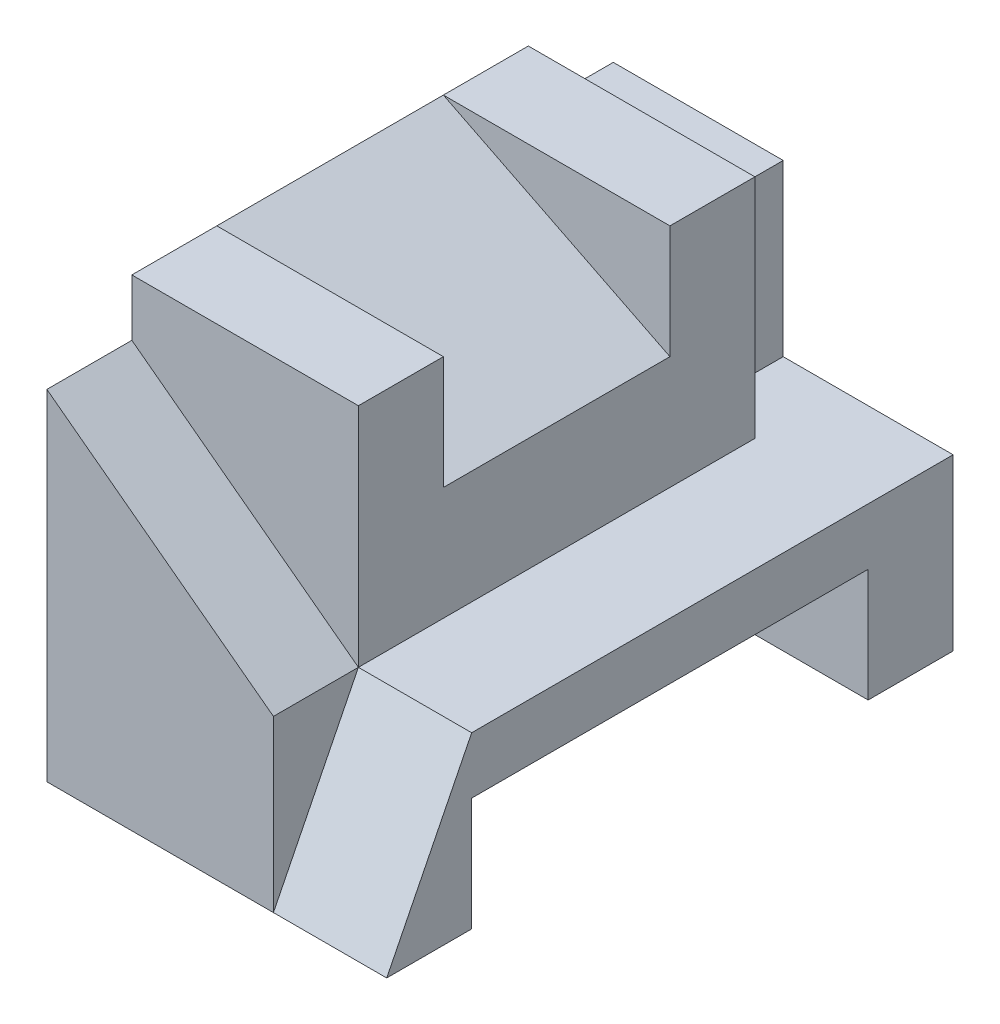
ISO-10303-21;
HEADER;
FILE_DESCRIPTION(('STEP AP214'),'2;1');
FILE_NAME('part.step','',(''),(''),'','','');
FILE_SCHEMA(('AUTOMOTIVE_DESIGN { 1 0 10303 214 1 1 1 1 }'));
ENDSEC;
DATA;
#1=APPLICATION_CONTEXT('core data for automotive mechanical design processes');
#2=APPLICATION_PROTOCOL_DEFINITION('international standard','automotive_design',2000,#1);
#3=PRODUCT_CONTEXT('',#1,'mechanical');
#4=PRODUCT('Part','Part','',(#3));
#5=PRODUCT_RELATED_PRODUCT_CATEGORY('part','',(#4));
#6=PRODUCT_DEFINITION_FORMATION('','',#4);
#7=PRODUCT_DEFINITION_CONTEXT('part definition',#1,'design');
#8=PRODUCT_DEFINITION('design','',#6,#7);
#9=PRODUCT_DEFINITION_SHAPE('','',#8);
#10=(LENGTH_UNIT() NAMED_UNIT(*) SI_UNIT(.MILLI.,.METRE.));
#11=(NAMED_UNIT(*) PLANE_ANGLE_UNIT() SI_UNIT($,.RADIAN.));
#12=(NAMED_UNIT(*) SI_UNIT($,.STERADIAN.) SOLID_ANGLE_UNIT());
#13=UNCERTAINTY_MEASURE_WITH_UNIT(LENGTH_MEASURE(1.E-05),#10,'distance_accuracy_value','');
#14=(GEOMETRIC_REPRESENTATION_CONTEXT(3) GLOBAL_UNCERTAINTY_ASSIGNED_CONTEXT((#13)) GLOBAL_UNIT_ASSIGNED_CONTEXT((#10,
#11,#12)) REPRESENTATION_CONTEXT('',''));
#15=CARTESIAN_POINT('',(0.,0.,0.));
#16=DIRECTION('',(0.,0.,1.));
#17=DIRECTION('',(1.,0.,0.));
#18=AXIS2_PLACEMENT_3D('',#15,#16,#17);
#19=CARTESIAN_POINT('',(-6.,7.,5.5));
#20=DIRECTION('',(0.,0.,-1.));
#21=DIRECTION('',(-1.,0.,0.));
#22=AXIS2_PLACEMENT_3D('',#19,#20,#21);
#23=PLANE('',#22);
#24=DIRECTION('',(1.,0.,0.));
#25=VECTOR('',#24,1.);
#26=CARTESIAN_POINT('',(-6.,5.,5.5));
#27=LINE('',#26,#25);
#28=CARTESIAN_POINT('',(-6.,5.,5.5));
#29=VERTEX_POINT('',#28);
#30=CARTESIAN_POINT('',(-2.,5.,5.5));
#31=VERTEX_POINT('',#30);
#32=EDGE_CURVE('E101',#29,#31,#27,.T.);
#33=ORIENTED_EDGE('',*,*,#32,.T.);
#34=DIRECTION('',(-0.894427190999917,0.447213595499956,0.));
#35=VECTOR('',#34,1.);
#36=CARTESIAN_POINT('',(-6.00000000000003,7.,5.5));
#37=LINE('',#36,#35);
#38=CARTESIAN_POINT('',(-6.,7.,5.5));
#39=VERTEX_POINT('',#38);
#40=EDGE_CURVE('E12',#31,#39,#37,.T.);
#41=ORIENTED_EDGE('',*,*,#40,.T.);
#42=DIRECTION('',(0.,-1.,0.));
#43=VECTOR('',#42,1.);
#44=CARTESIAN_POINT('',(-6.,7.,5.5));
#45=LINE('',#44,#43);
#46=EDGE_CURVE('E94',#39,#29,#45,.T.);
#47=ORIENTED_EDGE('',*,*,#46,.T.);
#48=EDGE_LOOP('',(#33,#41,#47));
#49=FACE_BOUND('',#48,.T.);
#50=ADVANCED_FACE('F55',(#49),#23,.F.);
#51=CARTESIAN_POINT('',(-2.,7.,1.5));
#52=DIRECTION('',(0.,0.,1.));
#53=DIRECTION('',(1.,0.,0.));
#54=AXIS2_PLACEMENT_3D('',#51,#52,#53);
#55=PLANE('',#54);
#56=DIRECTION('',(0.,-1.,0.));
#57=VECTOR('',#56,1.);
#58=CARTESIAN_POINT('',(-6.,7.,1.5));
#59=LINE('',#58,#57);
#60=CARTESIAN_POINT('',(-6.,7.,1.5));
#61=VERTEX_POINT('',#60);
#62=CARTESIAN_POINT('',(-6.,5.,1.5));
#63=VERTEX_POINT('',#62);
#64=EDGE_CURVE('E96',#61,#63,#59,.T.);
#65=ORIENTED_EDGE('',*,*,#64,.F.);
#66=DIRECTION('',(0.894427190999917,-0.447213595499956,0.));
#67=VECTOR('',#66,1.);
#68=CARTESIAN_POINT('',(-6.00000000000003,7.,1.5));
#69=LINE('',#68,#67);
#70=CARTESIAN_POINT('',(-2.,5.,1.5));
#71=VERTEX_POINT('',#70);
#72=EDGE_CURVE('E65',#61,#71,#69,.T.);
#73=ORIENTED_EDGE('',*,*,#72,.T.);
#74=DIRECTION('',(-1.,0.,0.));
#75=VECTOR('',#74,1.);
#76=CARTESIAN_POINT('',(-2.,5.,1.5));
#77=LINE('',#76,#75);
#78=EDGE_CURVE('E86',#71,#63,#77,.T.);
#79=ORIENTED_EDGE('',*,*,#78,.T.);
#80=EDGE_LOOP('',(#65,#73,#79));
#81=FACE_BOUND('',#80,.T.);
#82=ADVANCED_FACE('F111',(#81),#55,.F.);
#83=CARTESIAN_POINT('',(-6.,7.,1.5));
#84=DIRECTION('',(1.,0.,0.));
#85=DIRECTION('',(0.,0.,-1.));
#86=AXIS2_PLACEMENT_3D('',#83,#84,#85);
#87=PLANE('',#86);
#88=DIRECTION('',(0.,0.,1.));
#89=VECTOR('',#88,1.);
#90=CARTESIAN_POINT('',(-6.,5.,1.5));
#91=LINE('',#90,#89);
#92=EDGE_CURVE('E91',#63,#29,#91,.T.);
#93=ORIENTED_EDGE('',*,*,#92,.T.);
#94=ORIENTED_EDGE('',*,*,#46,.F.);
#95=DIRECTION('',(0.,0.,1.));
#96=VECTOR('',#95,1.);
#97=CARTESIAN_POINT('',(-6.,7.,1.5));
#98=LINE('',#97,#96);
#99=EDGE_CURVE('E99',#61,#39,#98,.T.);
#100=ORIENTED_EDGE('',*,*,#99,.F.);
#101=ORIENTED_EDGE('',*,*,#64,.T.);
#102=EDGE_LOOP('',(#93,#94,#100,#101));
#103=FACE_BOUND('',#102,.T.);
#104=ADVANCED_FACE('F92',(#103),#87,.F.);
#105=CARTESIAN_POINT('',(0.,5.,0.));
#106=DIRECTION('',(0.,1.,0.));
#107=DIRECTION('',(0.,0.,1.));
#108=AXIS2_PLACEMENT_3D('',#105,#106,#107);
#109=PLANE('',#108);
#110=ORIENTED_EDGE('',*,*,#32,.F.);
#111=ORIENTED_EDGE('',*,*,#92,.F.);
#112=ORIENTED_EDGE('',*,*,#78,.F.);
#113=DIRECTION('',(0.,0.,-1.));
#114=VECTOR('',#113,1.);
#115=CARTESIAN_POINT('',(-2.,5.,5.5));
#116=LINE('',#115,#114);
#117=EDGE_CURVE('E105',#31,#71,#116,.T.);
#118=ORIENTED_EDGE('',*,*,#117,.F.);
#119=EDGE_LOOP('',(#110,#111,#112,#118));
#120=FACE_BOUND('',#119,.T.);
#121=ADVANCED_FACE('F103',(#120),#109,.F.);
#122=CARTESIAN_POINT('',(-6.00000000000003,7.,0.));
#123=DIRECTION('',(0.447213595499956,0.894427190999917,0.));
#124=DIRECTION('',(0.,0.,1.));
#125=AXIS2_PLACEMENT_3D('',#122,#123,#124);
#126=PLANE('',#125);
#127=ORIENTED_EDGE('',*,*,#40,.F.);
#128=ORIENTED_EDGE('',*,*,#117,.T.);
#129=ORIENTED_EDGE('',*,*,#72,.F.);
#130=ORIENTED_EDGE('',*,*,#99,.T.);
#131=EDGE_LOOP('',(#127,#128,#129,#130));
#132=FACE_BOUND('',#131,.T.);
#133=ADVANCED_FACE('F58',(#132),#126,.T.);
#134=CLOSED_SHELL('',(#50,#82,#104,#121,#133));
#135=MANIFOLD_SOLID_BREP('B2',#134);
#136=CARTESIAN_POINT('',(-2.,3.,8.5));
#137=DIRECTION('',(0.,1.,0.));
#138=DIRECTION('',(0.,0.,1.));
#139=AXIS2_PLACEMENT_3D('',#136,#137,#138);
#140=PLANE('',#139);
#141=DIRECTION('',(0.,0.,1.));
#142=VECTOR('',#141,1.);
#143=CARTESIAN_POINT('',(-3.,3.,-1.5));
#144=LINE('',#143,#142);
#145=CARTESIAN_POINT('',(-3.,3.,-1.5));
#146=VERTEX_POINT('',#145);
#147=CARTESIAN_POINT('',(-3.,3.,0.));
#148=VERTEX_POINT('',#147);
#149=EDGE_CURVE('E315',#146,#148,#144,.T.);
#150=ORIENTED_EDGE('',*,*,#149,.T.);
#151=DIRECTION('',(1.,0.,0.));
#152=VECTOR('',#151,1.);
#153=CARTESIAN_POINT('',(-6.,3.,0.));
#154=LINE('',#153,#152);
#155=CARTESIAN_POINT('',(-2.,3.,0.));
#156=VERTEX_POINT('',#155);
#157=EDGE_CURVE('E181',#148,#156,#154,.T.);
#158=ORIENTED_EDGE('',*,*,#157,.T.);
#159=DIRECTION('',(0.,0.,1.));
#160=VECTOR('',#159,1.);
#161=CARTESIAN_POINT('',(-2.,3.,0.));
#162=LINE('',#161,#160);
#163=CARTESIAN_POINT('',(-2.,2.99999999999999,7.));
#164=VERTEX_POINT('',#163);
#165=EDGE_CURVE('E362',#156,#164,#162,.T.);
#166=ORIENTED_EDGE('',*,*,#165,.T.);
#167=DIRECTION('',(1.,0.,0.));
#168=VECTOR('',#167,1.);
#169=CARTESIAN_POINT('',(-2.,3.,7.));
#170=LINE('',#169,#168);
#171=CARTESIAN_POINT('',(0.,3.,7.));
#172=VERTEX_POINT('',#171);
#173=EDGE_CURVE('E466',#164,#172,#170,.T.);
#174=ORIENTED_EDGE('',*,*,#173,.T.);
#175=DIRECTION('',(0.,0.,1.));
#176=VECTOR('',#175,1.);
#177=CARTESIAN_POINT('',(0.,3.,8.5));
#178=LINE('',#177,#176);
#179=CARTESIAN_POINT('',(0.,3.,-1.5));
#180=VERTEX_POINT('',#179);
#181=EDGE_CURVE('E443',#180,#172,#178,.T.);
#182=ORIENTED_EDGE('',*,*,#181,.F.);
#183=DIRECTION('',(1.,0.,0.));
#184=VECTOR('',#183,1.);
#185=CARTESIAN_POINT('',(-2.,3.,-1.5));
#186=LINE('',#185,#184);
#187=EDGE_CURVE('E480',#146,#180,#186,.T.);
#188=ORIENTED_EDGE('',*,*,#187,.F.);
#189=EDGE_LOOP('',(#150,#158,#166,#174,#182,#188));
#190=FACE_BOUND('',#189,.T.);
#191=ADVANCED_FACE('F156',(#190),#140,.T.);
#192=CARTESIAN_POINT('',(-2.,0.,-1.5));
#193=DIRECTION('',(0.,-1.,0.));
#194=DIRECTION('',(0.,0.,-1.));
#195=AXIS2_PLACEMENT_3D('',#192,#193,#194);
#196=PLANE('',#195);
#197=DIRECTION('',(0.,0.,-1.));
#198=VECTOR('',#197,1.);
#199=CARTESIAN_POINT('',(0.,0.,-1.5));
#200=LINE('',#199,#198);
#201=CARTESIAN_POINT('',(0.,0.,0.));
#202=VERTEX_POINT('',#201);
#203=CARTESIAN_POINT('',(0.,0.,-1.5));
#204=VERTEX_POINT('',#203);
#205=EDGE_CURVE('E435',#202,#204,#200,.T.);
#206=ORIENTED_EDGE('',*,*,#205,.F.);
#207=DIRECTION('',(1.,0.,0.));
#208=VECTOR('',#207,1.);
#209=CARTESIAN_POINT('',(-2.,0.,0.));
#210=LINE('',#209,#208);
#211=CARTESIAN_POINT('',(-6.,0.,0.));
#212=VERTEX_POINT('',#211);
#213=EDGE_CURVE('E463',#212,#202,#210,.T.);
#214=ORIENTED_EDGE('',*,*,#213,.F.);
#215=DIRECTION('',(0.,0.,1.));
#216=VECTOR('',#215,1.);
#217=CARTESIAN_POINT('',(-6.,0.,-1.5));
#218=LINE('',#217,#216);
#219=CARTESIAN_POINT('',(-6.,0.,-1.5));
#220=VERTEX_POINT('',#219);
#221=EDGE_CURVE('E301',#220,#212,#218,.T.);
#222=ORIENTED_EDGE('',*,*,#221,.F.);
#223=DIRECTION('',(1.,0.,0.));
#224=VECTOR('',#223,1.);
#225=CARTESIAN_POINT('',(-2.,0.,-1.5));
#226=LINE('',#225,#224);
#227=EDGE_CURVE('E296',#220,#204,#226,.T.);
#228=ORIENTED_EDGE('',*,*,#227,.T.);
#229=EDGE_LOOP('',(#206,#214,#222,#228));
#230=FACE_BOUND('',#229,.T.);
#231=ADVANCED_FACE('F552',(#230),#196,.T.);
#232=CARTESIAN_POINT('',(-2.,0.,0.));
#233=DIRECTION('',(0.,0.,1.));
#234=DIRECTION('',(1.,0.,0.));
#235=AXIS2_PLACEMENT_3D('',#232,#233,#234);
#236=PLANE('',#235);
#237=DIRECTION('',(0.,-1.,0.));
#238=VECTOR('',#237,1.);
#239=CARTESIAN_POINT('',(0.,0.,0.));
#240=LINE('',#239,#238);
#241=CARTESIAN_POINT('',(0.,2.,0.));
#242=VERTEX_POINT('',#241);
#243=EDGE_CURVE('E459',#242,#202,#240,.T.);
#244=ORIENTED_EDGE('',*,*,#243,.F.);
#245=DIRECTION('',(1.,0.,0.));
#246=VECTOR('',#245,1.);
#247=CARTESIAN_POINT('',(-2.,2.,0.));
#248=LINE('',#247,#246);
#249=CARTESIAN_POINT('',(-6.,2.,0.));
#250=VERTEX_POINT('',#249);
#251=EDGE_CURVE('E467',#250,#242,#248,.T.);
#252=ORIENTED_EDGE('',*,*,#251,.F.);
#253=DIRECTION('',(0.,1.,0.));
#254=VECTOR('',#253,1.);
#255=CARTESIAN_POINT('',(-6.,0.,0.));
#256=LINE('',#255,#254);
#257=EDGE_CURVE('E420',#212,#250,#256,.T.);
#258=ORIENTED_EDGE('',*,*,#257,.F.);
#259=ORIENTED_EDGE('',*,*,#213,.T.);
#260=EDGE_LOOP('',(#244,#252,#258,#259));
#261=FACE_BOUND('',#260,.T.);
#262=ADVANCED_FACE('F556',(#261),#236,.T.);
#263=CARTESIAN_POINT('',(-2.,2.,0.));
#264=DIRECTION('',(0.,-1.,0.));
#265=DIRECTION('',(0.,0.,-1.));
#266=AXIS2_PLACEMENT_3D('',#263,#264,#265);
#267=PLANE('',#266);
#268=DIRECTION('',(0.,0.,-1.));
#269=VECTOR('',#268,1.);
#270=CARTESIAN_POINT('',(0.,2.,0.));
#271=LINE('',#270,#269);
#272=CARTESIAN_POINT('',(0.,2.,7.));
#273=VERTEX_POINT('',#272);
#274=EDGE_CURVE('E455',#273,#242,#271,.T.);
#275=ORIENTED_EDGE('',*,*,#274,.F.);
#276=DIRECTION('',(1.,0.,0.));
#277=VECTOR('',#276,1.);
#278=CARTESIAN_POINT('',(-2.,2.,7.));
#279=LINE('',#278,#277);
#280=CARTESIAN_POINT('',(-6.,2.,7.));
#281=VERTEX_POINT('',#280);
#282=EDGE_CURVE('E470',#281,#273,#279,.T.);
#283=ORIENTED_EDGE('',*,*,#282,.F.);
#284=DIRECTION('',(0.,0.,1.));
#285=VECTOR('',#284,1.);
#286=CARTESIAN_POINT('',(-6.,2.,0.));
#287=LINE('',#286,#285);
#288=EDGE_CURVE('E424',#250,#281,#287,.T.);
#289=ORIENTED_EDGE('',*,*,#288,.F.);
#290=ORIENTED_EDGE('',*,*,#251,.T.);
#291=EDGE_LOOP('',(#275,#283,#289,#290));
#292=FACE_BOUND('',#291,.T.);
#293=ADVANCED_FACE('F559',(#292),#267,.T.);
#294=CARTESIAN_POINT('',(-2.,2.,7.));
#295=DIRECTION('',(0.,0.,-1.));
#296=DIRECTION('',(-1.,0.,0.));
#297=AXIS2_PLACEMENT_3D('',#294,#295,#296);
#298=PLANE('',#297);
#299=DIRECTION('',(0.,1.,0.));
#300=VECTOR('',#299,1.);
#301=CARTESIAN_POINT('',(0.,2.,7.));
#302=LINE('',#301,#300);
#303=CARTESIAN_POINT('',(0.,0.,7.));
#304=VERTEX_POINT('',#303);
#305=EDGE_CURVE('E451',#304,#273,#302,.T.);
#306=ORIENTED_EDGE('',*,*,#305,.F.);
#307=DIRECTION('',(1.,0.,0.));
#308=VECTOR('',#307,1.);
#309=CARTESIAN_POINT('',(-2.,0.,7.));
#310=LINE('',#309,#308);
#311=CARTESIAN_POINT('',(-6.,0.,7.));
#312=VERTEX_POINT('',#311);
#313=EDGE_CURVE('E473',#312,#304,#310,.T.);
#314=ORIENTED_EDGE('',*,*,#313,.F.);
#315=DIRECTION('',(0.,-1.,0.));
#316=VECTOR('',#315,1.);
#317=CARTESIAN_POINT('',(-6.,2.,7.));
#318=LINE('',#317,#316);
#319=EDGE_CURVE('E408',#281,#312,#318,.T.);
#320=ORIENTED_EDGE('',*,*,#319,.F.);
#321=ORIENTED_EDGE('',*,*,#282,.T.);
#322=EDGE_LOOP('',(#306,#314,#320,#321));
#323=FACE_BOUND('',#322,.T.);
#324=ADVANCED_FACE('F563',(#323),#298,.T.);
#325=CARTESIAN_POINT('',(-2.,0.,7.));
#326=DIRECTION('',(0.,-1.,0.));
#327=DIRECTION('',(0.,0.,-1.));
#328=AXIS2_PLACEMENT_3D('',#325,#326,#327);
#329=PLANE('',#328);
#330=DIRECTION('',(0.,0.,-1.));
#331=VECTOR('',#330,1.);
#332=CARTESIAN_POINT('',(0.,0.,7.));
#333=LINE('',#332,#331);
#334=CARTESIAN_POINT('',(0.,0.,8.5));
#335=VERTEX_POINT('',#334);
#336=EDGE_CURVE('E447',#335,#304,#333,.T.);
#337=ORIENTED_EDGE('',*,*,#336,.F.);
#338=DIRECTION('',(1.,0.,0.));
#339=VECTOR('',#338,1.);
#340=CARTESIAN_POINT('',(-2.,0.,8.5));
#341=LINE('',#340,#339);
#342=CARTESIAN_POINT('',(-2.,0.,8.5));
#343=VERTEX_POINT('',#342);
#344=EDGE_CURVE('E476',#343,#335,#341,.T.);
#345=ORIENTED_EDGE('',*,*,#344,.F.);
#346=DIRECTION('',(1.,0.,0.));
#347=VECTOR('',#346,1.);
#348=CARTESIAN_POINT('',(-6.,0.,8.5));
#349=LINE('',#348,#347);
#350=CARTESIAN_POINT('',(-6.,0.,8.5));
#351=VERTEX_POINT('',#350);
#352=EDGE_CURVE('E428',#351,#343,#349,.T.);
#353=ORIENTED_EDGE('',*,*,#352,.F.);
#354=DIRECTION('',(0.,0.,1.));
#355=VECTOR('',#354,1.);
#356=CARTESIAN_POINT('',(-6.,0.,7.));
#357=LINE('',#356,#355);
#358=EDGE_CURVE('E412',#312,#351,#357,.T.);
#359=ORIENTED_EDGE('',*,*,#358,.F.);
#360=ORIENTED_EDGE('',*,*,#313,.T.);
#361=EDGE_LOOP('',(#337,#345,#353,#359,#360));
#362=FACE_BOUND('',#361,.T.);
#363=ADVANCED_FACE('F567',(#362),#329,.T.);
#364=CARTESIAN_POINT('',(-2.,3.,-1.5));
#365=DIRECTION('',(0.,0.,-1.));
#366=DIRECTION('',(0.,1.,0.));
#367=AXIS2_PLACEMENT_3D('',#364,#365,#366);
#368=PLANE('',#367);
#369=DIRECTION('',(0.,1.,0.));
#370=VECTOR('',#369,1.);
#371=CARTESIAN_POINT('',(0.,3.,-1.5));
#372=LINE('',#371,#370);
#373=EDGE_CURVE('E439',#204,#180,#372,.T.);
#374=ORIENTED_EDGE('',*,*,#373,.F.);
#375=ORIENTED_EDGE('',*,*,#227,.F.);
#376=DIRECTION('',(0.,-1.,0.));
#377=VECTOR('',#376,1.);
#378=CARTESIAN_POINT('',(-6.,3.,-1.5));
#379=LINE('',#378,#377);
#380=CARTESIAN_POINT('',(-6.,6.,-1.5));
#381=VERTEX_POINT('',#380);
#382=EDGE_CURVE('E291',#381,#220,#379,.T.);
#383=ORIENTED_EDGE('',*,*,#382,.F.);
#384=DIRECTION('',(-1.,0.,0.));
#385=VECTOR('',#384,1.);
#386=CARTESIAN_POINT('',(-3.,6.,-1.5));
#387=LINE('',#386,#385);
#388=CARTESIAN_POINT('',(-3.,6.,-1.5));
#389=VERTEX_POINT('',#388);
#390=EDGE_CURVE('E294',#389,#381,#387,.T.);
#391=ORIENTED_EDGE('',*,*,#390,.F.);
#392=DIRECTION('',(0.,-1.,0.));
#393=VECTOR('',#392,1.);
#394=CARTESIAN_POINT('',(-3.,6.,-1.5));
#395=LINE('',#394,#393);
#396=EDGE_CURVE('E323',#389,#146,#395,.T.);
#397=ORIENTED_EDGE('',*,*,#396,.T.);
#398=ORIENTED_EDGE('',*,*,#187,.T.);
#399=EDGE_LOOP('',(#374,#375,#383,#391,#397,#398));
#400=FACE_BOUND('',#399,.T.);
#401=ADVANCED_FACE('F293',(#400),#368,.T.);
#402=CARTESIAN_POINT('',(0.,0.,0.));
#403=DIRECTION('',(-1.,0.,0.));
#404=DIRECTION('',(0.,0.,1.));
#405=AXIS2_PLACEMENT_3D('',#402,#403,#404);
#406=PLANE('',#405);
#407=ORIENTED_EDGE('',*,*,#181,.T.);
#408=DIRECTION('',(0.,0.894427190999916,-0.447213595499958));
#409=VECTOR('',#408,1.);
#410=CARTESIAN_POINT('',(0.,3.,7.));
#411=LINE('',#410,#409);
#412=EDGE_CURVE('E488',#172,#335,#411,.F.);
#413=ORIENTED_EDGE('',*,*,#412,.T.);
#414=ORIENTED_EDGE('',*,*,#336,.T.);
#415=ORIENTED_EDGE('',*,*,#305,.T.);
#416=ORIENTED_EDGE('',*,*,#274,.T.);
#417=ORIENTED_EDGE('',*,*,#243,.T.);
#418=ORIENTED_EDGE('',*,*,#205,.T.);
#419=ORIENTED_EDGE('',*,*,#373,.T.);
#420=EDGE_LOOP('',(#407,#413,#414,#415,#416,#417,#418,#419));
#421=FACE_BOUND('',#420,.T.);
#422=ADVANCED_FACE('F548',(#421),#406,.F.);
#423=CARTESIAN_POINT('',(-2.,3.,7.));
#424=DIRECTION('',(0.,-0.447213595499958,-0.894427190999916));
#425=DIRECTION('',(1.,0.,0.));
#426=AXIS2_PLACEMENT_3D('',#423,#424,#425);
#427=PLANE('',#426);
#428=DIRECTION('',(0.,-0.894427190999916,0.447213595499958));
#429=VECTOR('',#428,1.);
#430=CARTESIAN_POINT('',(-2.,3.4,6.8));
#431=LINE('',#430,#429);
#432=EDGE_CURVE('E491',#343,#164,#431,.F.);
#433=ORIENTED_EDGE('',*,*,#432,.F.);
#434=ORIENTED_EDGE('',*,*,#344,.T.);
#435=ORIENTED_EDGE('',*,*,#412,.F.);
#436=ORIENTED_EDGE('',*,*,#173,.F.);
#437=EDGE_LOOP('',(#433,#434,#435,#436));
#438=FACE_BOUND('',#437,.T.);
#439=ADVANCED_FACE('F569',(#438),#427,.F.);
#440=CARTESIAN_POINT('',(-2.,0.,0.));
#441=DIRECTION('',(-1.,0.,0.));
#442=DIRECTION('',(0.,0.,1.));
#443=AXIS2_PLACEMENT_3D('',#440,#441,#442);
#444=PLANE('',#443);
#445=ORIENTED_EDGE('',*,*,#432,.T.);
#446=DIRECTION('',(0.,0.,1.));
#447=VECTOR('',#446,1.);
#448=CARTESIAN_POINT('',(-2.,2.99999999999999,8.5));
#449=LINE('',#448,#447);
#450=CARTESIAN_POINT('',(-2.,2.99999999999999,8.5));
#451=VERTEX_POINT('',#450);
#452=EDGE_CURVE('E166',#164,#451,#449,.T.);
#453=ORIENTED_EDGE('',*,*,#452,.T.);
#454=DIRECTION('',(0.,1.,0.));
#455=VECTOR('',#454,1.);
#456=CARTESIAN_POINT('',(-2.,3.,8.5));
#457=LINE('',#456,#455);
#458=EDGE_CURVE('E407',#343,#451,#457,.T.);
#459=ORIENTED_EDGE('',*,*,#458,.F.);
#460=EDGE_LOOP('',(#445,#453,#459));
#461=FACE_BOUND('',#460,.T.);
#462=ADVANCED_FACE('F501',(#461),#444,.F.);
#463=CARTESIAN_POINT('',(-6.,3.,8.5));
#464=DIRECTION('',(0.,0.,-1.));
#465=DIRECTION('',(-1.,0.,0.));
#466=AXIS2_PLACEMENT_3D('',#463,#464,#465);
#467=PLANE('',#466);
#468=ORIENTED_EDGE('',*,*,#458,.T.);
#469=DIRECTION('',(-0.800000000000001,0.599999999999999,0.));
#470=VECTOR('',#469,1.);
#471=CARTESIAN_POINT('',(-6.00000000000002,6.,8.5));
#472=LINE('',#471,#470);
#473=CARTESIAN_POINT('',(-6.,6.,8.5));
#474=VERTEX_POINT('',#473);
#475=EDGE_CURVE('E53',#451,#474,#472,.T.);
#476=ORIENTED_EDGE('',*,*,#475,.T.);
#477=DIRECTION('',(0.,1.,0.));
#478=VECTOR('',#477,1.);
#479=CARTESIAN_POINT('',(-6.,3.,8.5));
#480=LINE('',#479,#478);
#481=EDGE_CURVE('E302',#351,#474,#480,.T.);
#482=ORIENTED_EDGE('',*,*,#481,.F.);
#483=ORIENTED_EDGE('',*,*,#352,.T.);
#484=EDGE_LOOP('',(#468,#476,#482,#483));
#485=FACE_BOUND('',#484,.T.);
#486=ADVANCED_FACE('F507',(#485),#467,.F.);
#487=CARTESIAN_POINT('',(-6.,0.,0.));
#488=DIRECTION('',(-1.,0.,0.));
#489=DIRECTION('',(0.,0.,1.));
#490=AXIS2_PLACEMENT_3D('',#487,#488,#489);
#491=PLANE('',#490);
#492=DIRECTION('',(0.,0.,1.));
#493=VECTOR('',#492,1.);
#494=CARTESIAN_POINT('',(-6.,6.,-1.5));
#495=LINE('',#494,#493);
#496=CARTESIAN_POINT('',(-6.,6.,0.));
#497=VERTEX_POINT('',#496);
#498=EDGE_CURVE('E173',#381,#497,#495,.T.);
#499=ORIENTED_EDGE('',*,*,#498,.F.);
#500=ORIENTED_EDGE('',*,*,#382,.T.);
#501=ORIENTED_EDGE('',*,*,#221,.T.);
#502=ORIENTED_EDGE('',*,*,#257,.T.);
#503=ORIENTED_EDGE('',*,*,#288,.T.);
#504=ORIENTED_EDGE('',*,*,#319,.T.);
#505=ORIENTED_EDGE('',*,*,#358,.T.);
#506=ORIENTED_EDGE('',*,*,#481,.T.);
#507=DIRECTION('',(0.,0.,1.));
#508=VECTOR('',#507,1.);
#509=CARTESIAN_POINT('',(-6.,6.,7.));
#510=LINE('',#509,#508);
#511=CARTESIAN_POINT('',(-6.,6.,7.));
#512=VERTEX_POINT('',#511);
#513=EDGE_CURVE('E383',#512,#474,#510,.T.);
#514=ORIENTED_EDGE('',*,*,#513,.F.);
#515=DIRECTION('',(0.,-1.,0.));
#516=VECTOR('',#515,1.);
#517=CARTESIAN_POINT('',(-6.,0.,7.));
#518=LINE('',#517,#516);
#519=CARTESIAN_POINT('',(-6.,7.,7.));
#520=VERTEX_POINT('',#519);
#521=EDGE_CURVE('E335',#520,#512,#518,.T.);
#522=ORIENTED_EDGE('',*,*,#521,.F.);
#523=DIRECTION('',(0.,0.,-1.));
#524=VECTOR('',#523,1.);
#525=CARTESIAN_POINT('',(-6.,7.,0.));
#526=LINE('',#525,#524);
#527=CARTESIAN_POINT('',(-6.,7.,5.5));
#528=VERTEX_POINT('',#527);
#529=EDGE_CURVE('E331',#520,#528,#526,.T.);
#530=ORIENTED_EDGE('',*,*,#529,.T.);
#531=DIRECTION('',(0.,-1.,0.));
#532=VECTOR('',#531,1.);
#533=CARTESIAN_POINT('',(-6.,0.,5.5));
#534=LINE('',#533,#532);
#535=CARTESIAN_POINT('',(-6.,5.,5.5));
#536=VERTEX_POINT('',#535);
#537=EDGE_CURVE('E351',#528,#536,#534,.T.);
#538=ORIENTED_EDGE('',*,*,#537,.T.);
#539=DIRECTION('',(0.,0.,-1.));
#540=VECTOR('',#539,1.);
#541=CARTESIAN_POINT('',(-6.,5.,0.));
#542=LINE('',#541,#540);
#543=CARTESIAN_POINT('',(-6.,5.,1.5));
#544=VERTEX_POINT('',#543);
#545=EDGE_CURVE('E348',#536,#544,#542,.T.);
#546=ORIENTED_EDGE('',*,*,#545,.T.);
#547=DIRECTION('',(0.,1.,0.));
#548=VECTOR('',#547,1.);
#549=CARTESIAN_POINT('',(-6.,0.,1.5));
#550=LINE('',#549,#548);
#551=CARTESIAN_POINT('',(-6.,7.,1.5));
#552=VERTEX_POINT('',#551);
#553=EDGE_CURVE('E345',#544,#552,#550,.T.);
#554=ORIENTED_EDGE('',*,*,#553,.T.);
#555=DIRECTION('',(0.,0.,-1.));
#556=VECTOR('',#555,1.);
#557=CARTESIAN_POINT('',(-6.,7.,0.));
#558=LINE('',#557,#556);
#559=CARTESIAN_POINT('',(-6.,7.,0.));
#560=VERTEX_POINT('',#559);
#561=EDGE_CURVE('E342',#552,#560,#558,.T.);
#562=ORIENTED_EDGE('',*,*,#561,.T.);
#563=DIRECTION('',(0.,-1.,0.));
#564=VECTOR('',#563,1.);
#565=CARTESIAN_POINT('',(-6.,0.,0.));
#566=LINE('',#565,#564);
#567=EDGE_CURVE('E307',#560,#497,#566,.T.);
#568=ORIENTED_EDGE('',*,*,#567,.T.);
#569=EDGE_LOOP('',(#499,#500,#501,#502,#503,#504,#505,#506,#514,#522,#530,#538,#546,#554,#562,#568));
#570=FACE_BOUND('',#569,.T.);
#571=ADVANCED_FACE('F305',(#570),#491,.T.);
#572=CARTESIAN_POINT('',(-6.00000000000002,6.,0.));
#573=DIRECTION('',(0.599999999999999,0.800000000000001,0.));
#574=DIRECTION('',(0.,0.,1.));
#575=AXIS2_PLACEMENT_3D('',#572,#573,#574);
#576=PLANE('',#575);
#577=ORIENTED_EDGE('',*,*,#475,.F.);
#578=ORIENTED_EDGE('',*,*,#452,.F.);
#579=DIRECTION('',(0.800000000000001,-0.599999999999999,0.));
#580=VECTOR('',#579,1.);
#581=CARTESIAN_POINT('',(-6.00000000000002,6.,7.));
#582=LINE('',#581,#580);
#583=EDGE_CURVE('E495',#512,#164,#582,.T.);
#584=ORIENTED_EDGE('',*,*,#583,.F.);
#585=ORIENTED_EDGE('',*,*,#513,.T.);
#586=EDGE_LOOP('',(#577,#578,#584,#585));
#587=FACE_BOUND('',#586,.T.);
#588=ADVANCED_FACE('F159',(#587),#576,.T.);
#589=CARTESIAN_POINT('',(-6.,7.,0.));
#590=DIRECTION('',(0.,-1.,0.));
#591=DIRECTION('',(0.,0.,-1.));
#592=AXIS2_PLACEMENT_3D('',#589,#590,#591);
#593=PLANE('',#592);
#594=DIRECTION('',(0.,0.,-1.));
#595=VECTOR('',#594,1.);
#596=CARTESIAN_POINT('',(-2.,7.,0.));
#597=LINE('',#596,#595);
#598=CARTESIAN_POINT('',(-2.,7.,7.));
#599=VERTEX_POINT('',#598);
#600=CARTESIAN_POINT('',(-2.,7.,5.5));
#601=VERTEX_POINT('',#600);
#602=EDGE_CURVE('E330',#599,#601,#597,.T.);
#603=ORIENTED_EDGE('',*,*,#602,.T.);
#604=DIRECTION('',(1.,0.,0.));
#605=VECTOR('',#604,1.);
#606=CARTESIAN_POINT('',(-6.,7.,5.5));
#607=LINE('',#606,#605);
#608=EDGE_CURVE('E379',#528,#601,#607,.T.);
#609=ORIENTED_EDGE('',*,*,#608,.F.);
#610=ORIENTED_EDGE('',*,*,#529,.F.);
#611=DIRECTION('',(1.,0.,0.));
#612=VECTOR('',#611,1.);
#613=CARTESIAN_POINT('',(-6.,7.,7.));
#614=LINE('',#613,#612);
#615=EDGE_CURVE('E354',#520,#599,#614,.T.);
#616=ORIENTED_EDGE('',*,*,#615,.T.);
#617=EDGE_LOOP('',(#603,#609,#610,#616));
#618=FACE_BOUND('',#617,.T.);
#619=ADVANCED_FACE('F519',(#618),#593,.F.);
#620=CARTESIAN_POINT('',(-6.,0.,5.5));
#621=DIRECTION('',(0.,0.,1.));
#622=DIRECTION('',(1.,0.,0.));
#623=AXIS2_PLACEMENT_3D('',#620,#621,#622);
#624=PLANE('',#623);
#625=DIRECTION('',(0.,-1.,0.));
#626=VECTOR('',#625,1.);
#627=CARTESIAN_POINT('',(-2.,0.,5.5));
#628=LINE('',#627,#626);
#629=CARTESIAN_POINT('',(-2.,5.,5.5));
#630=VERTEX_POINT('',#629);
#631=EDGE_CURVE('E336',#601,#630,#628,.T.);
#632=ORIENTED_EDGE('',*,*,#631,.T.);
#633=DIRECTION('',(1.,0.,0.));
#634=VECTOR('',#633,1.);
#635=CARTESIAN_POINT('',(-6.,5.,5.5));
#636=LINE('',#635,#634);
#637=EDGE_CURVE('E384',#536,#630,#636,.T.);
#638=ORIENTED_EDGE('',*,*,#637,.F.);
#639=ORIENTED_EDGE('',*,*,#537,.F.);
#640=ORIENTED_EDGE('',*,*,#608,.T.);
#641=EDGE_LOOP('',(#632,#638,#639,#640));
#642=FACE_BOUND('',#641,.T.);
#643=ADVANCED_FACE('F524',(#642),#624,.F.);
#644=CARTESIAN_POINT('',(-6.,5.,0.));
#645=DIRECTION('',(0.,-1.,0.));
#646=DIRECTION('',(0.,0.,-1.));
#647=AXIS2_PLACEMENT_3D('',#644,#645,#646);
#648=PLANE('',#647);
#649=DIRECTION('',(0.,0.,-1.));
#650=VECTOR('',#649,1.);
#651=CARTESIAN_POINT('',(-2.,5.,0.));
#652=LINE('',#651,#650);
#653=CARTESIAN_POINT('',(-2.,5.,1.5));
#654=VERTEX_POINT('',#653);
#655=EDGE_CURVE('E374',#630,#654,#652,.T.);
#656=ORIENTED_EDGE('',*,*,#655,.T.);
#657=DIRECTION('',(1.,0.,0.));
#658=VECTOR('',#657,1.);
#659=CARTESIAN_POINT('',(-6.,5.,1.5));
#660=LINE('',#659,#658);
#661=EDGE_CURVE('E388',#544,#654,#660,.T.);
#662=ORIENTED_EDGE('',*,*,#661,.F.);
#663=ORIENTED_EDGE('',*,*,#545,.F.);
#664=ORIENTED_EDGE('',*,*,#637,.T.);
#665=EDGE_LOOP('',(#656,#662,#663,#664));
#666=FACE_BOUND('',#665,.T.);
#667=ADVANCED_FACE('F527',(#666),#648,.F.);
#668=CARTESIAN_POINT('',(-6.,0.,1.5));
#669=DIRECTION('',(0.,0.,-1.));
#670=DIRECTION('',(-1.,0.,0.));
#671=AXIS2_PLACEMENT_3D('',#668,#669,#670);
#672=PLANE('',#671);
#673=DIRECTION('',(0.,1.,0.));
#674=VECTOR('',#673,1.);
#675=CARTESIAN_POINT('',(-2.,0.,1.5));
#676=LINE('',#675,#674);
#677=CARTESIAN_POINT('',(-2.,7.,1.5));
#678=VERTEX_POINT('',#677);
#679=EDGE_CURVE('E371',#654,#678,#676,.T.);
#680=ORIENTED_EDGE('',*,*,#679,.T.);
#681=DIRECTION('',(1.,0.,0.));
#682=VECTOR('',#681,1.);
#683=CARTESIAN_POINT('',(-6.,7.,1.5));
#684=LINE('',#683,#682);
#685=EDGE_CURVE('E392',#552,#678,#684,.T.);
#686=ORIENTED_EDGE('',*,*,#685,.F.);
#687=ORIENTED_EDGE('',*,*,#553,.F.);
#688=ORIENTED_EDGE('',*,*,#661,.T.);
#689=EDGE_LOOP('',(#680,#686,#687,#688));
#690=FACE_BOUND('',#689,.T.);
#691=ADVANCED_FACE('F532',(#690),#672,.F.);
#692=CARTESIAN_POINT('',(-6.,7.,0.));
#693=DIRECTION('',(0.,-1.,0.));
#694=DIRECTION('',(0.,0.,-1.));
#695=AXIS2_PLACEMENT_3D('',#692,#693,#694);
#696=PLANE('',#695);
#697=DIRECTION('',(0.,0.,-1.));
#698=VECTOR('',#697,1.);
#699=CARTESIAN_POINT('',(-2.,7.,0.));
#700=LINE('',#699,#698);
#701=CARTESIAN_POINT('',(-2.,7.,0.));
#702=VERTEX_POINT('',#701);
#703=EDGE_CURVE('E368',#678,#702,#700,.T.);
#704=ORIENTED_EDGE('',*,*,#703,.T.);
#705=DIRECTION('',(1.,0.,0.));
#706=VECTOR('',#705,1.);
#707=CARTESIAN_POINT('',(-6.,7.,0.));
#708=LINE('',#707,#706);
#709=EDGE_CURVE('E396',#560,#702,#708,.T.);
#710=ORIENTED_EDGE('',*,*,#709,.F.);
#711=ORIENTED_EDGE('',*,*,#561,.F.);
#712=ORIENTED_EDGE('',*,*,#685,.T.);
#713=EDGE_LOOP('',(#704,#710,#711,#712));
#714=FACE_BOUND('',#713,.T.);
#715=ADVANCED_FACE('F536',(#714),#696,.F.);
#716=CARTESIAN_POINT('',(-6.,0.,0.));
#717=DIRECTION('',(0.,0.,1.));
#718=DIRECTION('',(0.,-1.,0.));
#719=AXIS2_PLACEMENT_3D('',#716,#717,#718);
#720=PLANE('',#719);
#721=ORIENTED_EDGE('',*,*,#157,.F.);
#722=DIRECTION('',(0.,-1.,0.));
#723=VECTOR('',#722,1.);
#724=CARTESIAN_POINT('',(-3.,6.,0.));
#725=LINE('',#724,#723);
#726=CARTESIAN_POINT('',(-3.,6.,0.));
#727=VERTEX_POINT('',#726);
#728=EDGE_CURVE('E327',#727,#148,#725,.T.);
#729=ORIENTED_EDGE('',*,*,#728,.F.);
#730=DIRECTION('',(1.,0.,0.));
#731=VECTOR('',#730,1.);
#732=CARTESIAN_POINT('',(-6.,6.,0.));
#733=LINE('',#732,#731);
#734=EDGE_CURVE('E309',#497,#727,#733,.T.);
#735=ORIENTED_EDGE('',*,*,#734,.F.);
#736=ORIENTED_EDGE('',*,*,#567,.F.);
#737=ORIENTED_EDGE('',*,*,#709,.T.);
#738=DIRECTION('',(0.,-1.,0.));
#739=VECTOR('',#738,1.);
#740=CARTESIAN_POINT('',(-2.,0.,0.));
#741=LINE('',#740,#739);
#742=EDGE_CURVE('E365',#702,#156,#741,.T.);
#743=ORIENTED_EDGE('',*,*,#742,.T.);
#744=EDGE_LOOP('',(#721,#729,#735,#736,#737,#743));
#745=FACE_BOUND('',#744,.T.);
#746=ADVANCED_FACE('F540',(#745),#720,.F.);
#747=CARTESIAN_POINT('',(-6.,0.,7.));
#748=DIRECTION('',(0.,0.,1.));
#749=DIRECTION('',(0.,-1.,0.));
#750=AXIS2_PLACEMENT_3D('',#747,#748,#749);
#751=PLANE('',#750);
#752=ORIENTED_EDGE('',*,*,#521,.T.);
#753=ORIENTED_EDGE('',*,*,#583,.T.);
#754=DIRECTION('',(0.,-1.,0.));
#755=VECTOR('',#754,1.);
#756=CARTESIAN_POINT('',(-2.,0.,7.));
#757=LINE('',#756,#755);
#758=EDGE_CURVE('E358',#599,#164,#757,.T.);
#759=ORIENTED_EDGE('',*,*,#758,.F.);
#760=ORIENTED_EDGE('',*,*,#615,.F.);
#761=EDGE_LOOP('',(#752,#753,#759,#760));
#762=FACE_BOUND('',#761,.T.);
#763=ADVANCED_FACE('F513',(#762),#751,.T.);
#764=CARTESIAN_POINT('',(-2.,0.,0.));
#765=DIRECTION('',(1.,0.,0.));
#766=DIRECTION('',(0.,0.,-1.));
#767=AXIS2_PLACEMENT_3D('',#764,#765,#766);
#768=PLANE('',#767);
#769=ORIENTED_EDGE('',*,*,#602,.F.);
#770=ORIENTED_EDGE('',*,*,#758,.T.);
#771=ORIENTED_EDGE('',*,*,#165,.F.);
#772=ORIENTED_EDGE('',*,*,#742,.F.);
#773=ORIENTED_EDGE('',*,*,#703,.F.);
#774=ORIENTED_EDGE('',*,*,#679,.F.);
#775=ORIENTED_EDGE('',*,*,#655,.F.);
#776=ORIENTED_EDGE('',*,*,#631,.F.);
#777=EDGE_LOOP('',(#769,#770,#771,#772,#773,#774,#775,#776));
#778=FACE_BOUND('',#777,.T.);
#779=ADVANCED_FACE('F572',(#778),#768,.T.);
#780=CARTESIAN_POINT('',(-3.,6.,-1.5));
#781=DIRECTION('',(1.,0.,0.));
#782=DIRECTION('',(0.,0.,-1.));
#783=AXIS2_PLACEMENT_3D('',#780,#781,#782);
#784=PLANE('',#783);
#785=ORIENTED_EDGE('',*,*,#149,.F.);
#786=ORIENTED_EDGE('',*,*,#396,.F.);
#787=DIRECTION('',(0.,0.,1.));
#788=VECTOR('',#787,1.);
#789=CARTESIAN_POINT('',(-3.,6.,-1.5));
#790=LINE('',#789,#788);
#791=EDGE_CURVE('E313',#389,#727,#790,.T.);
#792=ORIENTED_EDGE('',*,*,#791,.T.);
#793=ORIENTED_EDGE('',*,*,#728,.T.);
#794=EDGE_LOOP('',(#785,#786,#792,#793));
#795=FACE_BOUND('',#794,.T.);
#796=ADVANCED_FACE('F544',(#795),#784,.T.);
#797=CARTESIAN_POINT('',(0.,6.,0.));
#798=DIRECTION('',(0.,1.,0.));
#799=DIRECTION('',(0.,0.,1.));
#800=AXIS2_PLACEMENT_3D('',#797,#798,#799);
#801=PLANE('',#800);
#802=ORIENTED_EDGE('',*,*,#390,.T.);
#803=ORIENTED_EDGE('',*,*,#498,.T.);
#804=ORIENTED_EDGE('',*,*,#734,.T.);
#805=ORIENTED_EDGE('',*,*,#791,.F.);
#806=EDGE_LOOP('',(#802,#803,#804,#805));
#807=FACE_BOUND('',#806,.T.);
#808=ADVANCED_FACE('F311',(#807),#801,.T.);
#809=CLOSED_SHELL('',(#191,#231,#262,#293,#324,#363,#401,#422,#439,#462,#486,#571,#588,#619,
#643,#667,#691,#715,#746,#763,#779,#796,#808));
#810=MANIFOLD_SOLID_BREP('B6',#809);
#811=ADVANCED_BREP_SHAPE_REPRESENTATION('',(#18,#135,#810),#14);
#812=SHAPE_DEFINITION_REPRESENTATION(#9,#811);
ENDSEC;
END-ISO-10303-21;
